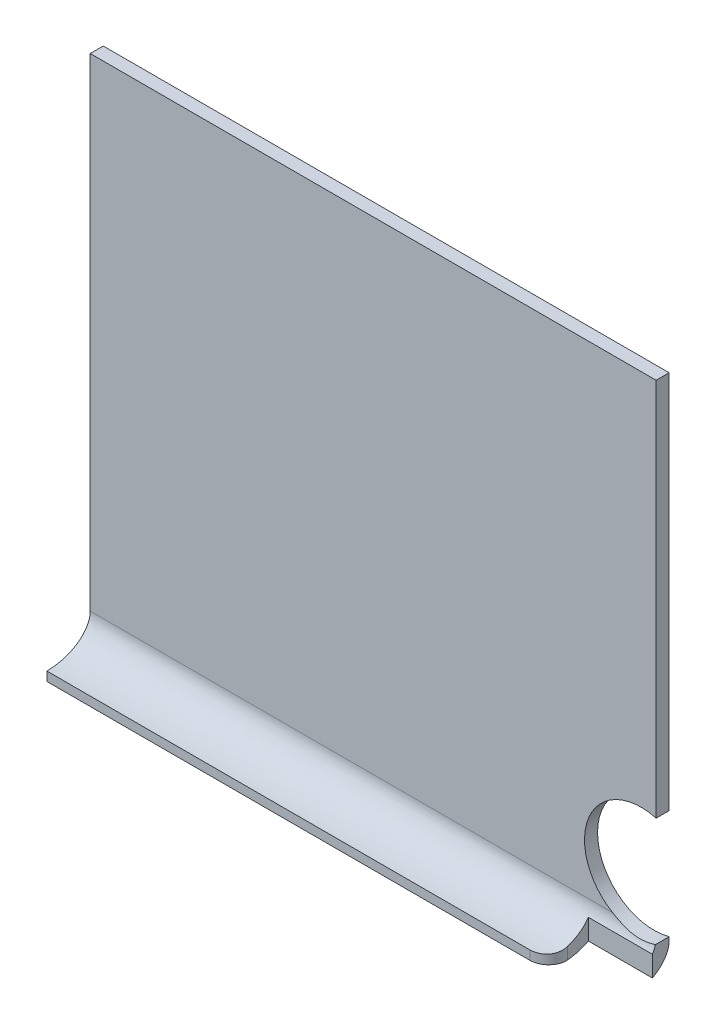
ISO-10303-21;
HEADER;
FILE_DESCRIPTION(('STEP AP214'),'2;1');
FILE_NAME('part.step','',(''),(''),'','','');
FILE_SCHEMA(('AUTOMOTIVE_DESIGN { 1 0 10303 214 1 1 1 1 }'));
ENDSEC;
DATA;
#1=APPLICATION_CONTEXT('core data for automotive mechanical design processes');
#2=APPLICATION_PROTOCOL_DEFINITION('international standard','automotive_design',2000,#1);
#3=PRODUCT_CONTEXT('',#1,'mechanical');
#4=PRODUCT('Part','Part','',(#3));
#5=PRODUCT_RELATED_PRODUCT_CATEGORY('part','',(#4));
#6=PRODUCT_DEFINITION_FORMATION('','',#4);
#7=PRODUCT_DEFINITION_CONTEXT('part definition',#1,'design');
#8=PRODUCT_DEFINITION('design','',#6,#7);
#9=PRODUCT_DEFINITION_SHAPE('','',#8);
#10=(LENGTH_UNIT() NAMED_UNIT(*) SI_UNIT(.MILLI.,.METRE.));
#11=(NAMED_UNIT(*) PLANE_ANGLE_UNIT() SI_UNIT($,.RADIAN.));
#12=(NAMED_UNIT(*) SI_UNIT($,.STERADIAN.) SOLID_ANGLE_UNIT());
#13=UNCERTAINTY_MEASURE_WITH_UNIT(LENGTH_MEASURE(1.E-05),#10,'distance_accuracy_value','');
#14=(GEOMETRIC_REPRESENTATION_CONTEXT(3) GLOBAL_UNCERTAINTY_ASSIGNED_CONTEXT((#13)) GLOBAL_UNIT_ASSIGNED_CONTEXT((#10,
#11,#12)) REPRESENTATION_CONTEXT('',''));
#15=CARTESIAN_POINT('',(0.,0.,0.));
#16=DIRECTION('',(0.,0.,1.));
#17=DIRECTION('',(1.,0.,0.));
#18=AXIS2_PLACEMENT_3D('',#15,#16,#17);
#19=CARTESIAN_POINT('',(0.,0.,0.));
#20=DIRECTION('',(1.,0.,0.));
#21=DIRECTION('',(0.,0.,-1.));
#22=AXIS2_PLACEMENT_3D('',#19,#20,#21);
#23=PLANE('',#22);
#24=DIRECTION('',(0.,-1.,0.));
#25=VECTOR('',#24,1.);
#26=CARTESIAN_POINT('',(0.,25.118910613293,-233.449973367811));
#27=LINE('',#26,#25);
#28=CARTESIAN_POINT('',(0.,145.118910613293,-233.449973367811));
#29=VERTEX_POINT('',#28);
#30=CARTESIAN_POINT('',(0.,14.718910613293,-233.449973367811));
#31=VERTEX_POINT('',#30);
#32=EDGE_CURVE('E173',#29,#31,#27,.T.);
#33=ORIENTED_EDGE('',*,*,#32,.T.);
#34=CARTESIAN_POINT('',(0.,14.718910613293,-210.449973367811));
#35=CARTESIAN_POINT('',(0.,30.718910613293,-210.449973367811));
#36=CARTESIAN_POINT('',(0.,30.718910613293,-233.449973367811));
#37=CARTESIAN_POINT('',(0.,14.718910613293,-233.449973367811));
#38=CARTESIAN_POINT('',(0.,-1.28108938670695,-233.449973367811));
#39=CARTESIAN_POINT('',(0.,-1.28108938670695,-210.449973367811));
#40=CARTESIAN_POINT('',(0.,14.718910613293,-210.449973367811));
#41=(BOUNDED_CURVE() B_SPLINE_CURVE(3,(#34,#35,#36,#37,#38,#39,#40),.UNSPECIFIED.,.T.,
.F.) B_SPLINE_CURVE_WITH_KNOTS((4,3,4),(0.,0.5,1.),
.UNSPECIFIED.) CURVE() GEOMETRIC_REPRESENTATION_ITEM() RATIONAL_B_SPLINE_CURVE((1.,
0.333333333333333,0.333333333333333,1.,0.333333333333333,0.333333333333333,1.)) REPRESENTATION_ITEM(''));
#42=CARTESIAN_POINT('',(0.,6.71891061329305,-221.949973367811));
#43=VERTEX_POINT('',#42);
#44=EDGE_CURVE('E167',#31,#43,#41,.T.);
#45=ORIENTED_EDGE('',*,*,#44,.T.);
#46=DIRECTION('',(0.,0.,1.));
#47=VECTOR('',#46,1.);
#48=CARTESIAN_POINT('',(0.,6.71891061329305,-202.589640738144));
#49=LINE('',#48,#47);
#50=CARTESIAN_POINT('',(0.,6.71891061329304,-218.500026632189));
#51=VERTEX_POINT('',#50);
#52=EDGE_CURVE('E174',#43,#51,#49,.T.);
#53=ORIENTED_EDGE('',*,*,#52,.T.);
#54=DIRECTION('',(0.,-1.,0.));
#55=VECTOR('',#54,1.);
#56=CARTESIAN_POINT('',(0.,-59.3810893867069,-218.500026632189));
#57=LINE('',#56,#55);
#58=CARTESIAN_POINT('',(0.,9.11891061337892,-218.500026632188));
#59=VERTEX_POINT('',#58);
#60=EDGE_CURVE('E192',#59,#51,#57,.T.);
#61=ORIENTED_EDGE('',*,*,#60,.F.);
#62=CARTESIAN_POINT('',(0.,25.1189106132931,-218.499973367811));
#63=CARTESIAN_POINT('',(0.,25.1189106132931,-195.499973367811));
#64=CARTESIAN_POINT('',(0.,9.11891061329311,-195.499973367811));
#65=CARTESIAN_POINT('',(0.,9.1189106132931,-218.499973367811));
#66=CARTESIAN_POINT('',(0.,9.1189106132931,-241.499973367811));
#67=CARTESIAN_POINT('',(0.,25.1189106132931,-241.499973367811));
#68=CARTESIAN_POINT('',(0.,25.1189106132931,-218.499973367811));
#69=(BOUNDED_CURVE() B_SPLINE_CURVE(3,(#62,#63,#64,#65,#66,#67,#68),.UNSPECIFIED.,.T.,
.F.) B_SPLINE_CURVE_WITH_KNOTS((4,3,4),(0.,0.5,1.),
.UNSPECIFIED.) CURVE() GEOMETRIC_REPRESENTATION_ITEM() RATIONAL_B_SPLINE_CURVE((1.,
0.333333333333333,0.333333333333333,1.,0.333333333333333,0.333333333333333,1.)) REPRESENTATION_ITEM(''));
#70=CARTESIAN_POINT('',(0.,17.1189106132931,-229.999973367811));
#71=VERTEX_POINT('',#70);
#72=EDGE_CURVE('E181',#71,#59,#69,.F.);
#73=ORIENTED_EDGE('',*,*,#72,.F.);
#74=DIRECTION('',(0.,-1.,0.));
#75=VECTOR('',#74,1.);
#76=CARTESIAN_POINT('',(0.,25.118910613293,-229.999973367811));
#77=LINE('',#76,#75);
#78=CARTESIAN_POINT('',(0.,145.118910613293,-229.999973367811));
#79=VERTEX_POINT('',#78);
#80=EDGE_CURVE('E149',#79,#71,#77,.T.);
#81=ORIENTED_EDGE('',*,*,#80,.F.);
#82=DIRECTION('',(0.,0.,1.));
#83=VECTOR('',#82,1.);
#84=CARTESIAN_POINT('',(0.,145.118910613293,230.000026632189));
#85=LINE('',#84,#83);
#86=EDGE_CURVE('E182',#29,#79,#85,.T.);
#87=ORIENTED_EDGE('',*,*,#86,.F.);
#88=EDGE_LOOP('',(#33,#45,#53,#61,#73,#81,#87));
#89=FACE_BOUND('',#88,.T.);
#90=ADVANCED_FACE('F34',(#89),#23,.F.);
#91=CARTESIAN_POINT('',(150.,0.,0.));
#92=DIRECTION('',(1.,0.,0.));
#93=DIRECTION('',(0.,0.,-1.));
#94=AXIS2_PLACEMENT_3D('',#91,#92,#93);
#95=PLANE('',#94);
#96=DIRECTION('',(0.,-1.,0.));
#97=VECTOR('',#96,1.);
#98=CARTESIAN_POINT('',(150.,25.118910613293,-233.449973367811));
#99=LINE('',#98,#97);
#100=CARTESIAN_POINT('',(150.,145.118910613293,-233.449973367811));
#101=VERTEX_POINT('',#100);
#102=CARTESIAN_POINT('',(150.,44.5820382074938,-233.449973367811));
#103=VERTEX_POINT('',#102);
#104=EDGE_CURVE('E140',#101,#103,#99,.T.);
#105=ORIENTED_EDGE('',*,*,#104,.F.);
#106=DIRECTION('',(0.,0.,1.));
#107=VECTOR('',#106,1.);
#108=CARTESIAN_POINT('',(150.,145.118910613293,230.000026632189));
#109=LINE('',#108,#107);
#110=CARTESIAN_POINT('',(150.,145.118910613293,-229.999973367811));
#111=VERTEX_POINT('',#110);
#112=EDGE_CURVE('E168',#101,#111,#109,.T.);
#113=ORIENTED_EDGE('',*,*,#112,.T.);
#114=DIRECTION('',(0.,-1.,0.));
#115=VECTOR('',#114,1.);
#116=CARTESIAN_POINT('',(150.,25.118910613293,-229.999973367811));
#117=LINE('',#116,#115);
#118=CARTESIAN_POINT('',(150.,44.5820382074938,-229.999973367811));
#119=VERTEX_POINT('',#118);
#120=EDGE_CURVE('E154',#111,#119,#117,.T.);
#121=ORIENTED_EDGE('',*,*,#120,.T.);
#122=DIRECTION('',(0.,0.,1.));
#123=VECTOR('',#122,1.);
#124=CARTESIAN_POINT('',(150.,44.5820382074938,-310.549973367811));
#125=LINE('',#124,#123);
#126=EDGE_CURVE('E131',#119,#103,#125,.F.);
#127=ORIENTED_EDGE('',*,*,#126,.T.);
#128=EDGE_LOOP('',(#105,#113,#121,#127));
#129=FACE_BOUND('',#128,.T.);
#130=ADVANCED_FACE('F152',(#129),#95,.T.);
#131=CARTESIAN_POINT('',(150.,14.718910613293,-210.449973367811));
#132=CARTESIAN_POINT('',(150.,30.718910613293,-210.449973367811));
#133=CARTESIAN_POINT('',(150.,30.718910613293,-233.449973367811));
#134=CARTESIAN_POINT('',(150.,14.718910613293,-233.449973367811));
#135=CARTESIAN_POINT('',(150.,-1.28108938670696,-233.449973367811));
#136=CARTESIAN_POINT('',(150.,-1.28108938670697,-210.449973367811));
#137=CARTESIAN_POINT('',(150.,14.718910613293,-210.449973367811));
#138=(BOUNDED_CURVE() B_SPLINE_CURVE(3,(#131,#132,#133,#134,#135,#136,#137),.UNSPECIFIED.,.T.,
.F.) B_SPLINE_CURVE_WITH_KNOTS((4,3,4),(0.,0.5,1.),
.UNSPECIFIED.) CURVE() GEOMETRIC_REPRESENTATION_ITEM() RATIONAL_B_SPLINE_CURVE((1.,
0.333333333333333,0.333333333333333,1.,0.333333333333333,0.333333333333333,1.)) REPRESENTATION_ITEM(''));
#139=CARTESIAN_POINT('',(150.,14.718910613293,-233.449973367811));
#140=VERTEX_POINT('',#139);
#141=CARTESIAN_POINT('',(150.,8.39854599144674,-229.000026632187));
#142=VERTEX_POINT('',#141);
#143=EDGE_CURVE('E176',#140,#142,#138,.T.);
#144=ORIENTED_EDGE('',*,*,#143,.F.);
#145=CARTESIAN_POINT('',(150.,15.6557830190929,-233.449973367811));
#146=VERTEX_POINT('',#145);
#147=EDGE_CURVE('E148',#146,#140,#99,.T.);
#148=ORIENTED_EDGE('',*,*,#147,.F.);
#149=DIRECTION('',(0.,0.,1.));
#150=VECTOR('',#149,1.);
#151=CARTESIAN_POINT('',(150.,15.6557830190929,-310.549973367811));
#152=LINE('',#151,#150);
#153=CARTESIAN_POINT('',(150.000000000012,15.6557830190961,-229.806005236423));
#154=VERTEX_POINT('',#153);
#155=EDGE_CURVE('E133',#146,#154,#152,.T.);
#156=ORIENTED_EDGE('',*,*,#155,.T.);
#157=CARTESIAN_POINT('',(150.,25.1189106132932,-218.499973367811));
#158=CARTESIAN_POINT('',(150.,25.1189106132931,-195.499973367811));
#159=CARTESIAN_POINT('',(150.,9.11891061329314,-195.499973367811));
#160=CARTESIAN_POINT('',(150.,9.11891061329313,-218.499973367811));
#161=CARTESIAN_POINT('',(150.,9.11891061329315,-241.499973367811));
#162=CARTESIAN_POINT('',(150.,25.1189106132931,-241.499973367811));
#163=CARTESIAN_POINT('',(150.,25.1189106132932,-218.499973367811));
#164=(BOUNDED_CURVE() B_SPLINE_CURVE(3,(#157,#158,#159,#160,#161,#162,#163),.UNSPECIFIED.,.T.,
.F.) B_SPLINE_CURVE_WITH_KNOTS((4,3,4),(0.,0.5,1.),
.UNSPECIFIED.) CURVE() GEOMETRIC_REPRESENTATION_ITEM() RATIONAL_B_SPLINE_CURVE((1.,
0.333333333333333,0.333333333333333,1.,0.333333333333333,0.333333333333333,1.)) REPRESENTATION_ITEM(''));
#165=CARTESIAN_POINT('',(150.,13.8560956428786,-229.000026632188));
#166=VERTEX_POINT('',#165);
#167=EDGE_CURVE('E158',#154,#166,#164,.F.);
#168=ORIENTED_EDGE('',*,*,#167,.T.);
#169=DIRECTION('',(0.,-1.,0.));
#170=VECTOR('',#169,1.);
#171=CARTESIAN_POINT('',(150.,-59.3810893867068,-229.000026632188));
#172=LINE('',#171,#170);
#173=EDGE_CURVE('E155',#166,#142,#172,.T.);
#174=ORIENTED_EDGE('',*,*,#173,.T.);
#175=EDGE_LOOP('',(#144,#148,#156,#168,#174));
#176=FACE_BOUND('',#175,.T.);
#177=ADVANCED_FACE('F253',(#176),#95,.T.);
#178=CARTESIAN_POINT('',(128.022822584558,-59.3810893867069,-223.500026632189));
#179=DIRECTION('',(0.,1.,0.));
#180=DIRECTION('',(-1.,0.,0.));
#181=AXIS2_PLACEMENT_3D('',#178,#179,#180);
#182=CYLINDRICAL_SURFACE('',#181,4.99999999999999);
#183=CARTESIAN_POINT('',(128.022822584558,6.71891061329304,-223.500026632189));
#184=DIRECTION('',(0.,-1.,0.));
#185=DIRECTION('',(0.,0.,-1.));
#186=AXIS2_PLACEMENT_3D('',#183,#184,#185);
#187=CIRCLE('',#186,4.99999999999999);
#188=CARTESIAN_POINT('',(128.022822584558,6.71891061329304,-218.500026632189));
#189=VERTEX_POINT('',#188);
#190=CARTESIAN_POINT('',(132.77648799954,6.71891061329302,-221.949973367811));
#191=VERTEX_POINT('',#190);
#192=EDGE_CURVE('E188',#189,#191,#187,.F.);
#193=ORIENTED_EDGE('',*,*,#192,.T.);
#194=CARTESIAN_POINT('',(132.77648799954,6.71891061329302,-221.949973367811));
#195=CARTESIAN_POINT('',(132.796996288085,6.71890987622342,-222.012864504485));
#196=CARTESIAN_POINT('',(132.816254695086,6.71926947927686,-222.076163368816));
#197=CARTESIAN_POINT('',(132.852152942139,6.72072832626091,-222.203146868445));
#198=CARTESIAN_POINT('',(132.868805470695,6.72182383936138,-222.266827959956));
#199=CARTESIAN_POINT('',(132.899528368375,6.724768072059,-222.394566485477));
#200=CARTESIAN_POINT('',(132.913607221897,6.72661424964093,-222.458621937234));
#201=CARTESIAN_POINT('',(132.939208714898,6.73107271313751,-222.587102402276));
#202=CARTESIAN_POINT('',(132.950735638499,6.73368369772315,-222.651526607043));
#203=CARTESIAN_POINT('',(132.971247548353,6.7396857015641,-222.780742437672));
#204=CARTESIAN_POINT('',(132.980232529416,6.74307672241242,-222.845534064284));
#205=CARTESIAN_POINT('',(132.995663231499,6.75065339688609,-222.975484341758));
#206=CARTESIAN_POINT('',(133.002104628029,6.75484038603518,-223.040643428271));
#207=CARTESIAN_POINT('',(133.01243855985,6.76402480952385,-223.171328408751));
#208=CARTESIAN_POINT('',(133.016322433282,6.76902492722332,-223.236854798882));
#209=CARTESIAN_POINT('',(133.021521497417,6.77985118024163,-223.368275629295));
#210=CARTESIAN_POINT('',(133.022823591934,6.78568136695377,-223.434170254288));
#211=CARTESIAN_POINT('',(133.022822584558,6.79191410836406,-223.500026632189));
#212=B_SPLINE_CURVE_WITH_KNOTS('',3,(#194,#195,#196,#197,#198,#199,#200,#201,#202,#203,#204,
#205,#206,#207,#208,#209,#210,#211),.UNSPECIFIED.,.F.,.F.,(4,2,2,2,2,2,2,2,4),(0.,
0.198437587751794,0.395876677151307,0.592652663645771,0.789095759094743,0.985539255730748,
1.18231531363538,1.37975443410503,1.57819253672441),.UNSPECIFIED.);
#213=CARTESIAN_POINT('',(133.022822584558,6.79191410836408,-223.500026632189));
#214=VERTEX_POINT('',#213);
#215=EDGE_CURVE('E236',#191,#214,#212,.T.);
#216=ORIENTED_EDGE('',*,*,#215,.T.);
#217=DIRECTION('',(0.,1.,0.));
#218=VECTOR('',#217,1.);
#219=CARTESIAN_POINT('',(133.022822584558,-59.3810893867068,-223.500026632189));
#220=LINE('',#219,#218);
#221=CARTESIAN_POINT('',(133.022822584558,9.91464496310106,-223.500026632189));
#222=VERTEX_POINT('',#221);
#223=EDGE_CURVE('E318',#214,#222,#220,.T.);
#224=ORIENTED_EDGE('',*,*,#223,.T.);
#225=CARTESIAN_POINT('',(128.022822584558,9.11891061337895,-218.500026632189));
#226=CARTESIAN_POINT('',(128.163326106063,9.11892408499997,-218.500011564238));
#227=CARTESIAN_POINT('',(128.303827475552,9.11891105569287,-218.505948372431));
#228=CARTESIAN_POINT('',(128.58382727978,9.11892935656308,-218.529616954258));
#229=CARTESIAN_POINT('',(128.72332575855,9.11896068478082,-218.547348206835));
#230=CARTESIAN_POINT('',(129.000249612315,9.11916498396389,-218.594482589359));
#231=CARTESIAN_POINT('',(129.137676195045,9.11933786888397,-218.623878623276));
#232=CARTESIAN_POINT('',(129.409566274773,9.12001330032028,-218.694128837388));
#233=CARTESIAN_POINT('',(129.544029808033,9.12051584279977,-218.734982877274));
#234=CARTESIAN_POINT('',(129.809087143464,9.12209809447129,-218.827876396739));
#235=CARTESIAN_POINT('',(129.939679540708,9.12317801056366,-218.879919882027));
#236=CARTESIAN_POINT('',(130.196059689496,9.12622069074032,-218.994831712057));
#237=CARTESIAN_POINT('',(130.321845648413,9.12818378079632,-219.05770404834));
#238=CARTESIAN_POINT('',(130.567597082139,9.13334230237643,-219.193770749286));
#239=CARTESIAN_POINT('',(130.687565443017,9.13653711566236,-219.266959923952));
#240=CARTESIAN_POINT('',(130.920923100282,9.14454455797868,-219.423173148491));
#241=CARTESIAN_POINT('',(131.034310117463,9.1493577435987,-219.506200575559));
#242=CARTESIAN_POINT('',(131.253198284843,9.1609833047438,-219.681097496734));
#243=CARTESIAN_POINT('',(131.358729007987,9.16778765212526,-219.772930506962));
#244=CARTESIAN_POINT('',(131.561633421766,9.18380848815487,-219.965011316083));
#245=CARTESIAN_POINT('',(131.659007250763,9.1930249358762,-220.065258972182));
#246=CARTESIAN_POINT('',(131.844897556754,9.21426702668563,-220.273385795023));
#247=CARTESIAN_POINT('',(131.93341378912,9.22629274732891,-220.381265172396));
#248=CARTESIAN_POINT('',(132.100924208171,9.25352032237983,-220.60374138392));
#249=CARTESIAN_POINT('',(132.179921931892,9.26872099121461,-220.718335699154));
#250=CARTESIAN_POINT('',(132.326721088696,9.30236452601004,-220.951471775069));
#251=CARTESIAN_POINT('',(132.394679811805,9.32075232364669,-221.069922463388));
#252=CARTESIAN_POINT('',(132.520445730326,9.36118529648203,-221.31143857115));
#253=CARTESIAN_POINT('',(132.57825665281,9.3832291230895,-221.434502276092));
#254=CARTESIAN_POINT('',(132.683462443453,9.43119104859138,-221.684316472387));
#255=CARTESIAN_POINT('',(132.73085469356,9.45711011853209,-221.811067881364));
#256=CARTESIAN_POINT('',(132.815005319988,9.51293627665133,-222.067140110793));
#257=CARTESIAN_POINT('',(132.851765546568,9.54284266960283,-222.196460479986));
#258=CARTESIAN_POINT('',(132.93010603354,9.62251411154276,-222.521003309695));
#259=CARTESIAN_POINT('',(132.965113232325,9.6747962194806,-222.717255283818));
#260=CARTESIAN_POINT('',(132.999877037913,9.75985010143877,-223.011457744985));
#261=CARTESIAN_POINT('',(133.00850727404,9.78928689947264,-223.109437338233));
#262=CARTESIAN_POINT('',(133.01997958721,9.85034062395666,-223.305063410504));
#263=CARTESIAN_POINT('',(133.022821297414,9.88195768844693,-223.402709868023));
#264=CARTESIAN_POINT('',(133.022822584558,9.91464496310106,-223.500026632189));
#265=B_SPLINE_CURVE_WITH_KNOTS('',3,(#225,#226,#227,#228,#229,#230,#231,#232,#233,#234,#235,
#236,#237,#238,#239,#240,#241,#242,#243,#244,#245,#246,#247,#248,#249,#250,#251,#252,#253,#254,
#255,#256,#257,#258,#259,#260,#261,#262,#263,#264),.UNSPECIFIED.,.F.,.F.,(4,2,2,2,2,2,2,2,2,2,2,
2,2,2,2,2,2,2,2,4),(0.,0.421382161010316,0.842745707383846,1.26385331789211,1.68495577194118,
2.10620922819714,2.52761829310622,2.94881611518788,3.37015894378754,3.78982583605087,
4.20948560816334,4.62915696713087,5.0486718938479,5.46155319792787,5.8742825407533,
6.2871154778691,6.69987652760927,7.31632308533325,7.62417773396744,7.93205189185901),.UNSPECIFIED.);
#266=CARTESIAN_POINT('',(128.022822584558,9.11891061337895,-218.500026632189));
#267=VERTEX_POINT('',#266);
#268=EDGE_CURVE('E191',#267,#222,#265,.T.);
#269=ORIENTED_EDGE('',*,*,#268,.F.);
#270=DIRECTION('',(0.,1.,0.));
#271=VECTOR('',#270,1.);
#272=CARTESIAN_POINT('',(128.022822584558,-59.3810893867069,-218.500026632189));
#273=LINE('',#272,#271);
#274=EDGE_CURVE('E283',#189,#267,#273,.T.);
#275=ORIENTED_EDGE('',*,*,#274,.F.);
#276=EDGE_LOOP('',(#193,#216,#224,#269,#275));
#277=FACE_BOUND('',#276,.T.);
#278=ADVANCED_FACE('F248',(#277),#182,.T.);
#279=CARTESIAN_POINT('',(-262.506364446809,6.71891061329305,-202.589640738144));
#280=DIRECTION('',(0.,-1.,0.));
#281=DIRECTION('',(0.,0.,-1.));
#282=AXIS2_PLACEMENT_3D('',#279,#280,#281);
#283=PLANE('',#282);
#284=ORIENTED_EDGE('',*,*,#52,.F.);
#285=DIRECTION('',(-1.,0.,0.));
#286=VECTOR('',#285,1.);
#287=CARTESIAN_POINT('',(-262.506364446809,6.71891061329308,-221.949973367811));
#288=LINE('',#287,#286);
#289=EDGE_CURVE('E302',#43,#191,#288,.F.);
#290=ORIENTED_EDGE('',*,*,#289,.T.);
#291=ORIENTED_EDGE('',*,*,#192,.F.);
#292=DIRECTION('',(1.,0.,0.));
#293=VECTOR('',#292,1.);
#294=CARTESIAN_POINT('',(-262.506364446809,6.71891061329306,-218.500026632189));
#295=LINE('',#294,#293);
#296=EDGE_CURVE('E183',#51,#189,#295,.T.);
#297=ORIENTED_EDGE('',*,*,#296,.F.);
#298=EDGE_LOOP('',(#284,#290,#291,#297));
#299=FACE_BOUND('',#298,.T.);
#300=ADVANCED_FACE('F231',(#299),#283,.T.);
#301=CARTESIAN_POINT('',(-208.50636444681,14.718910613293,-210.449973367811));
#302=CARTESIAN_POINT('',(-208.50636444681,30.7189106132931,-210.449973367811));
#303=CARTESIAN_POINT('',(-208.50636444681,30.7189106132931,-233.449973367811));
#304=CARTESIAN_POINT('',(-208.50636444681,14.718910613293,-233.449973367811));
#305=CARTESIAN_POINT('',(-208.50636444681,-1.28108938670693,-233.449973367811));
#306=CARTESIAN_POINT('',(-208.50636444681,-1.28108938670693,-210.449973367811));
#307=CARTESIAN_POINT('',(-208.50636444681,14.718910613293,-210.449973367811));
#308=(BOUNDED_CURVE() B_SPLINE_CURVE(3,(#301,#302,#303,#304,#305,#306,#307),.UNSPECIFIED.,.T.,
.F.) B_SPLINE_CURVE_WITH_KNOTS((4,3,4),(0.,0.5,1.),
.UNSPECIFIED.) CURVE() GEOMETRIC_REPRESENTATION_ITEM() RATIONAL_B_SPLINE_CURVE((1.,
0.333333333333333,0.333333333333333,1.,0.333333333333333,0.333333333333333,1.)) REPRESENTATION_ITEM(''));
#309=DIRECTION('',(-1.,0.,0.));
#310=VECTOR('',#309,1.);
#311=SURFACE_OF_LINEAR_EXTRUSION('',#308,#310);
#312=ORIENTED_EDGE('',*,*,#44,.F.);
#313=DIRECTION('',(-1.,0.,0.));
#314=VECTOR('',#313,1.);
#315=CARTESIAN_POINT('',(-208.50636444681,14.718910613293,-233.449973367811));
#316=LINE('',#315,#314);
#317=EDGE_CURVE('E300',#140,#31,#316,.T.);
#318=ORIENTED_EDGE('',*,*,#317,.F.);
#319=ORIENTED_EDGE('',*,*,#143,.T.);
#320=DIRECTION('',(-1.,0.,0.));
#321=VECTOR('',#320,1.);
#322=CARTESIAN_POINT('',(-208.50636444681,8.39854599144675,-229.000026632187));
#323=LINE('',#322,#321);
#324=CARTESIAN_POINT('',(133.022822584558,8.39854599144674,-229.000026632188));
#325=VERTEX_POINT('',#324);
#326=EDGE_CURVE('E298',#325,#142,#323,.F.);
#327=ORIENTED_EDGE('',*,*,#326,.F.);
#328=CARTESIAN_POINT('',(133.022822584558,14.718910613293,-210.449973367811));
#329=CARTESIAN_POINT('',(133.022822584558,30.718910613293,-210.449973367811));
#330=CARTESIAN_POINT('',(133.022822584558,30.718910613293,-233.449973367811));
#331=CARTESIAN_POINT('',(133.022822584558,14.718910613293,-233.449973367811));
#332=CARTESIAN_POINT('',(133.022822584558,-1.28108938670696,-233.449973367811));
#333=CARTESIAN_POINT('',(133.022822584558,-1.28108938670697,-210.449973367811));
#334=CARTESIAN_POINT('',(133.022822584558,14.718910613293,-210.449973367811));
#335=(BOUNDED_CURVE() B_SPLINE_CURVE(3,(#328,#329,#330,#331,#332,#333,#334),.UNSPECIFIED.,.T.,
.F.) B_SPLINE_CURVE_WITH_KNOTS((4,3,4),(0.,0.5,1.),
.UNSPECIFIED.) CURVE() GEOMETRIC_REPRESENTATION_ITEM() RATIONAL_B_SPLINE_CURVE((1.,
0.333333333333333,0.333333333333333,1.,0.333333333333333,0.333333333333333,1.)) REPRESENTATION_ITEM(''));
#336=EDGE_CURVE('E51',#214,#325,#335,.F.);
#337=ORIENTED_EDGE('',*,*,#336,.F.);
#338=ORIENTED_EDGE('',*,*,#215,.F.);
#339=ORIENTED_EDGE('',*,*,#289,.F.);
#340=EDGE_LOOP('',(#312,#318,#319,#327,#337,#338,#339));
#341=FACE_BOUND('',#340,.T.);
#342=ADVANCED_FACE('F225',(#341),#311,.T.);
#343=CARTESIAN_POINT('',(133.022822584558,-59.3810893867068,-229.000026632188));
#344=DIRECTION('',(-1.,0.,0.));
#345=DIRECTION('',(0.,0.,1.));
#346=AXIS2_PLACEMENT_3D('',#343,#344,#345);
#347=PLANE('',#346);
#348=ORIENTED_EDGE('',*,*,#336,.T.);
#349=DIRECTION('',(0.,1.,0.));
#350=VECTOR('',#349,1.);
#351=CARTESIAN_POINT('',(133.022822584558,-59.3810893867068,-229.000026632188));
#352=LINE('',#351,#350);
#353=CARTESIAN_POINT('',(133.022822584558,13.8560956428785,-229.000026632188));
#354=VERTEX_POINT('',#353);
#355=EDGE_CURVE('E137',#325,#354,#352,.T.);
#356=ORIENTED_EDGE('',*,*,#355,.T.);
#357=CARTESIAN_POINT('',(133.022822584558,25.1189106132932,-218.499973367811));
#358=CARTESIAN_POINT('',(133.022822584558,25.1189106132931,-195.499973367811));
#359=CARTESIAN_POINT('',(133.022822584558,9.11891061329316,-195.499973367811));
#360=CARTESIAN_POINT('',(133.022822584558,9.11891061329315,-218.499973367811));
#361=CARTESIAN_POINT('',(133.022822584558,9.11891061329314,-241.499973367811));
#362=CARTESIAN_POINT('',(133.022822584558,25.1189106132931,-241.499973367811));
#363=CARTESIAN_POINT('',(133.022822584558,25.1189106132932,-218.499973367811));
#364=(BOUNDED_CURVE() B_SPLINE_CURVE(3,(#357,#358,#359,#360,#361,#362,#363),.UNSPECIFIED.,.T.,
.F.) B_SPLINE_CURVE_WITH_KNOTS((4,3,4),(0.,0.5,1.),
.UNSPECIFIED.) CURVE() GEOMETRIC_REPRESENTATION_ITEM() RATIONAL_B_SPLINE_CURVE((1.,
0.333333333333333,0.333333333333333,1.,0.333333333333333,0.333333333333333,1.)) REPRESENTATION_ITEM(''));
#365=EDGE_CURVE('E265',#222,#354,#364,.T.);
#366=ORIENTED_EDGE('',*,*,#365,.F.);
#367=ORIENTED_EDGE('',*,*,#223,.F.);
#368=EDGE_LOOP('',(#348,#356,#366,#367));
#369=FACE_BOUND('',#368,.T.);
#370=ADVANCED_FACE('F230',(#369),#347,.F.);
#371=CARTESIAN_POINT('',(-208.50636444681,25.118910613293,-233.449973367811));
#372=DIRECTION('',(0.,0.,-1.));
#373=DIRECTION('',(0.,1.,0.));
#374=AXIS2_PLACEMENT_3D('',#371,#372,#373);
#375=PLANE('',#374);
#376=ORIENTED_EDGE('',*,*,#32,.F.);
#377=DIRECTION('',(-1.,0.,0.));
#378=VECTOR('',#377,1.);
#379=CARTESIAN_POINT('',(-208.50636444681,145.118910613293,-233.449973367811));
#380=LINE('',#379,#378);
#381=EDGE_CURVE('E144',#101,#29,#380,.T.);
#382=ORIENTED_EDGE('',*,*,#381,.F.);
#383=ORIENTED_EDGE('',*,*,#104,.T.);
#384=CARTESIAN_POINT('',(146.022822584561,30.1189106132933,-233.449973367811));
#385=DIRECTION('',(0.,0.,-1.));
#386=DIRECTION('',(0.,1.,0.));
#387=AXIS2_PLACEMENT_3D('',#384,#385,#386);
#388=CIRCLE('',#387,15.);
#389=EDGE_CURVE('E126',#146,#103,#388,.T.);
#390=ORIENTED_EDGE('',*,*,#389,.F.);
#391=ORIENTED_EDGE('',*,*,#147,.T.);
#392=ORIENTED_EDGE('',*,*,#317,.T.);
#393=EDGE_LOOP('',(#376,#382,#383,#390,#391,#392));
#394=FACE_BOUND('',#393,.T.);
#395=ADVANCED_FACE('F142',(#394),#375,.T.);
#396=CARTESIAN_POINT('',(-304.054799780113,25.1189106132931,-218.499973367811));
#397=CARTESIAN_POINT('',(-304.054799780113,25.118910613293,-195.499973367811));
#398=CARTESIAN_POINT('',(-304.054799780113,9.11891061329303,-195.499973367811));
#399=CARTESIAN_POINT('',(-304.054799780113,9.11891061329304,-218.499973367811));
#400=CARTESIAN_POINT('',(-304.054799780113,9.11891061329306,-241.499973367811));
#401=CARTESIAN_POINT('',(-304.054799780113,25.118910613293,-241.499973367811));
#402=CARTESIAN_POINT('',(-304.054799780113,25.1189106132931,-218.499973367811));
#403=(BOUNDED_CURVE() B_SPLINE_CURVE(3,(#396,#397,#398,#399,#400,#401,#402),.UNSPECIFIED.,.T.,
.F.) B_SPLINE_CURVE_WITH_KNOTS((4,3,4),(0.,0.5,1.),
.UNSPECIFIED.) CURVE() GEOMETRIC_REPRESENTATION_ITEM() RATIONAL_B_SPLINE_CURVE((1.,
0.333333333333333,0.333333333333333,1.,0.333333333333333,0.333333333333333,1.)) REPRESENTATION_ITEM(''));
#404=DIRECTION('',(1.,0.,0.));
#405=VECTOR('',#404,1.);
#406=SURFACE_OF_LINEAR_EXTRUSION('',#403,#405);
#407=DIRECTION('',(-1.,0.,0.));
#408=VECTOR('',#407,1.);
#409=CARTESIAN_POINT('',(205.493635553191,17.1189106132932,-229.999973367811));
#410=LINE('',#409,#408);
#411=CARTESIAN_POINT('',(138.539507811013,17.1189106132931,-229.999973367811));
#412=VERTEX_POINT('',#411);
#413=EDGE_CURVE('E266',#71,#412,#410,.F.);
#414=ORIENTED_EDGE('',*,*,#413,.F.);
#415=ORIENTED_EDGE('',*,*,#72,.T.);
#416=DIRECTION('',(1.,0.,0.));
#417=VECTOR('',#416,1.);
#418=CARTESIAN_POINT('',(-1.50636444680914,9.11891061337892,-218.500026632188));
#419=LINE('',#418,#417);
#420=EDGE_CURVE('E189',#59,#267,#419,.T.);
#421=ORIENTED_EDGE('',*,*,#420,.T.);
#422=ORIENTED_EDGE('',*,*,#268,.T.);
#423=ORIENTED_EDGE('',*,*,#365,.T.);
#424=DIRECTION('',(1.,0.,0.));
#425=VECTOR('',#424,1.);
#426=CARTESIAN_POINT('',(-1.50636444680916,13.8560956428786,-229.000026632188));
#427=LINE('',#426,#425);
#428=EDGE_CURVE('E58',#354,#166,#427,.T.);
#429=ORIENTED_EDGE('',*,*,#428,.T.);
#430=ORIENTED_EDGE('',*,*,#167,.F.);
#431=CARTESIAN_POINT('',(153.506137433666,17.1189106567871,-229.999973367811));
#432=CARTESIAN_POINT('',(153.335295203822,17.0205629563886,-229.999963216295));
#433=CARTESIAN_POINT('',(153.162532428289,16.9256015593285,-229.997366265085));
#434=CARTESIAN_POINT('',(152.813624609711,16.7426724535276,-229.988003910836));
#435=CARTESIAN_POINT('',(152.637482359482,16.6546992546954,-229.981241817339));
#436=CARTESIAN_POINT('',(152.28205348903,16.4858354145241,-229.964553536223));
#437=CARTESIAN_POINT('',(152.102767789892,16.4049427387631,-229.954628261299));
#438=CARTESIAN_POINT('',(151.741279907754,16.2503170082393,-229.932535076998));
#439=CARTESIAN_POINT('',(151.559077805542,16.1765837555505,-229.920367229645));
#440=CARTESIAN_POINT('',(151.191718917446,16.0362534334724,-229.894631039624));
#441=CARTESIAN_POINT('',(151.006557971066,15.9696676592902,-229.881060544879));
#442=CARTESIAN_POINT('',(150.633782018312,15.8438359623543,-229.853333133549));
#443=CARTESIAN_POINT('',(150.446166763785,15.7845907882472,-229.839176157346));
#444=CARTESIAN_POINT('',(150.068723827792,15.6735174103362,-229.811008609074));
#445=CARTESIAN_POINT('',(149.87889596216,15.6216898287701,-229.796998049377));
#446=CARTESIAN_POINT('',(149.497283843072,15.5255270392005,-229.769783374193));
#447=CARTESIAN_POINT('',(149.305499446715,15.4811923826789,-229.756579318111));
#448=CARTESIAN_POINT('',(148.845391789414,15.3843321703505,-229.726707676892));
#449=CARTESIAN_POINT('',(148.576278401647,15.3353155346067,-229.71068731343));
#450=CARTESIAN_POINT('',(148.035579631278,15.2520470094853,-229.682637532291));
#451=CARTESIAN_POINT('',(147.763994300626,15.2177948105406,-229.670608030939));
#452=CARTESIAN_POINT('',(147.219188342872,15.1641915828465,-229.651475319754));
#453=CARTESIAN_POINT('',(146.945967783656,15.1448399397621,-229.644371906824));
#454=CARTESIAN_POINT('',(146.399054147636,15.1211341616283,-229.63563911087));
#455=CARTESIAN_POINT('',(146.125361785029,15.1167655153878,-229.634004431357));
#456=CARTESIAN_POINT('',(145.578157123668,15.1230066142743,-229.636320455576));
#457=CARTESIAN_POINT('',(145.304644832601,15.1336169620103,-229.640271384019));
#458=CARTESIAN_POINT('',(144.758779705465,15.1697625399237,-229.65344979795));
#459=CARTESIAN_POINT('',(144.486426763949,15.1952963822252,-229.662676792766));
#460=CARTESIAN_POINT('',(143.816935105697,15.2765782794873,-229.691109176285));
#461=CARTESIAN_POINT('',(143.420916895367,15.3408676372683,-229.712962150833));
#462=CARTESIAN_POINT('',(142.635645132744,15.5008503924143,-229.762906557133));
#463=CARTESIAN_POINT('',(142.246393047233,15.5965505118657,-229.790999323819));
#464=CARTESIAN_POINT('',(141.477276532347,15.8186281845547,-229.848211955911));
#465=CARTESIAN_POINT('',(141.097402674933,15.9449734204385,-229.877330711872));
#466=CARTESIAN_POINT('',(140.348806954893,16.2277098872872,-229.930228826591));
#467=CARTESIAN_POINT('',(139.980078068629,16.3840817182127,-229.954011611497));
#468=CARTESIAN_POINT('',(139.434536709105,16.6416825669305,-229.980170299031));
#469=CARTESIAN_POINT('',(139.252775612181,16.7320638713747,-229.987318851927));
#470=CARTESIAN_POINT('',(138.893177476676,16.9200739879268,-229.997213394227));
#471=CARTESIAN_POINT('',(138.715336353004,17.0176947425884,-229.99996420356));
#472=CARTESIAN_POINT('',(138.539507735456,17.1189106567871,-229.999973367811));
#473=B_SPLINE_CURVE_WITH_KNOTS('',3,(#431,#432,#433,#434,#435,#436,#437,#438,#439,#440,#441,
#442,#443,#444,#445,#446,#447,#448,#449,#450,#451,#452,#453,#454,#455,#456,#457,#458,#459,#460,
#461,#462,#463,#464,#465,#466,#467,#468,#469,#470,#471,#472),.UNSPECIFIED.,.F.,.F.,(4,2,2,2,2,2,
2,2,2,2,2,2,2,2,2,2,2,2,2,2,4),(0.,0.591292354999973,1.18211548569953,1.77276829615194,
2.36340477304106,2.95496130568705,3.54657811990723,4.1382445338822,4.72995447576306,
5.55153370101404,6.37309569931443,7.19462382362114,8.01535606420339,8.83612132400867,
9.65681026529797,10.8607500668742,12.0649476867746,13.2678808781511,14.4700394594479,
15.0792050212516,15.6877024785842),.UNSPECIFIED.);
#474=EDGE_CURVE('E11',#154,#412,#473,.T.);
#475=ORIENTED_EDGE('',*,*,#474,.T.);
#476=EDGE_LOOP('',(#414,#415,#421,#422,#423,#429,#430,#475));
#477=FACE_BOUND('',#476,.T.);
#478=ADVANCED_FACE('F270',(#477),#406,.F.);
#479=CARTESIAN_POINT('',(-208.50636444681,25.1189106132931,-229.999973367811));
#480=DIRECTION('',(0.,0.,-1.));
#481=DIRECTION('',(0.,1.,0.));
#482=AXIS2_PLACEMENT_3D('',#479,#480,#481);
#483=PLANE('',#482);
#484=DIRECTION('',(-1.,0.,0.));
#485=VECTOR('',#484,1.);
#486=CARTESIAN_POINT('',(-208.50636444681,145.118910613293,-229.999973367811));
#487=LINE('',#486,#485);
#488=EDGE_CURVE('E303',#111,#79,#487,.T.);
#489=ORIENTED_EDGE('',*,*,#488,.T.);
#490=ORIENTED_EDGE('',*,*,#80,.T.);
#491=ORIENTED_EDGE('',*,*,#413,.T.);
#492=CARTESIAN_POINT('',(146.022822584561,30.1189106132933,-229.999973367811));
#493=DIRECTION('',(0.,0.,-1.));
#494=DIRECTION('',(0.,1.,0.));
#495=AXIS2_PLACEMENT_3D('',#492,#493,#494);
#496=CIRCLE('',#495,15.);
#497=EDGE_CURVE('E43',#412,#119,#496,.T.);
#498=ORIENTED_EDGE('',*,*,#497,.T.);
#499=ORIENTED_EDGE('',*,*,#120,.F.);
#500=EDGE_LOOP('',(#489,#490,#491,#498,#499));
#501=FACE_BOUND('',#500,.T.);
#502=ADVANCED_FACE('F273',(#501),#483,.F.);
#503=CARTESIAN_POINT('',(146.022822584561,30.1189106132933,-310.549973367811));
#504=DIRECTION('',(0.,0.,1.));
#505=DIRECTION('',(1.,0.,0.));
#506=AXIS2_PLACEMENT_3D('',#503,#504,#505);
#507=CYLINDRICAL_SURFACE('',#506,15.);
#508=ORIENTED_EDGE('',*,*,#126,.F.);
#509=ORIENTED_EDGE('',*,*,#497,.F.);
#510=ORIENTED_EDGE('',*,*,#474,.F.);
#511=ORIENTED_EDGE('',*,*,#155,.F.);
#512=ORIENTED_EDGE('',*,*,#389,.T.);
#513=EDGE_LOOP('',(#508,#509,#510,#511,#512));
#514=FACE_BOUND('',#513,.T.);
#515=ADVANCED_FACE('F128',(#514),#507,.F.);
#516=CARTESIAN_POINT('',(159.022822584558,-59.3810893867068,-229.000026632188));
#517=DIRECTION('',(0.,0.,-1.));
#518=DIRECTION('',(-1.,0.,0.));
#519=AXIS2_PLACEMENT_3D('',#516,#517,#518);
#520=PLANE('',#519);
#521=ORIENTED_EDGE('',*,*,#173,.F.);
#522=ORIENTED_EDGE('',*,*,#428,.F.);
#523=ORIENTED_EDGE('',*,*,#355,.F.);
#524=ORIENTED_EDGE('',*,*,#326,.T.);
#525=EDGE_LOOP('',(#521,#522,#523,#524));
#526=FACE_BOUND('',#525,.T.);
#527=ADVANCED_FACE('F255',(#526),#520,.F.);
#528=CARTESIAN_POINT('',(128.022822584558,-59.3810893867069,-218.500026632189));
#529=DIRECTION('',(0.,0.,-1.));
#530=DIRECTION('',(-1.,0.,0.));
#531=AXIS2_PLACEMENT_3D('',#528,#529,#530);
#532=PLANE('',#531);
#533=ORIENTED_EDGE('',*,*,#420,.F.);
#534=ORIENTED_EDGE('',*,*,#60,.T.);
#535=ORIENTED_EDGE('',*,*,#296,.T.);
#536=ORIENTED_EDGE('',*,*,#274,.T.);
#537=EDGE_LOOP('',(#533,#534,#535,#536));
#538=FACE_BOUND('',#537,.T.);
#539=ADVANCED_FACE('F288',(#538),#532,.F.);
#540=CARTESIAN_POINT('',(-199.506364446809,145.118910613293,230.000026632189));
#541=DIRECTION('',(0.,-1.,0.));
#542=DIRECTION('',(1.,0.,0.));
#543=AXIS2_PLACEMENT_3D('',#540,#541,#542);
#544=PLANE('',#543);
#545=ORIENTED_EDGE('',*,*,#381,.T.);
#546=ORIENTED_EDGE('',*,*,#86,.T.);
#547=ORIENTED_EDGE('',*,*,#488,.F.);
#548=ORIENTED_EDGE('',*,*,#112,.F.);
#549=EDGE_LOOP('',(#545,#546,#547,#548));
#550=FACE_BOUND('',#549,.T.);
#551=ADVANCED_FACE('F36',(#550),#544,.F.);
#552=CLOSED_SHELL('',(#90,#130,#177,#278,#300,#342,#370,#395,#478,#502,#515,#527,#539,#551));
#553=MANIFOLD_SOLID_BREP('B2',#552);
#554=ADVANCED_BREP_SHAPE_REPRESENTATION('',(#18,#553),#14);
#555=SHAPE_DEFINITION_REPRESENTATION(#9,#554);
ENDSEC;
END-ISO-10303-21;
